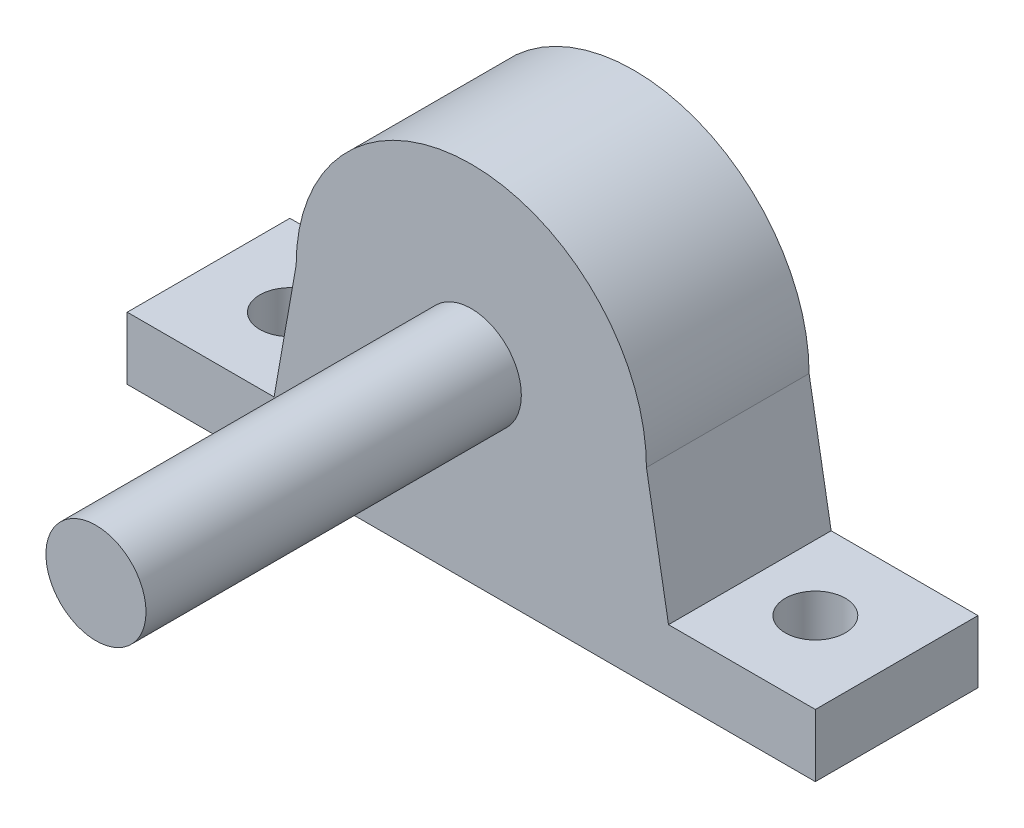
ISO-10303-21;
HEADER;
FILE_DESCRIPTION(('STEP AP214'),'2;1');
FILE_NAME('part.step','',(''),(''),'','','');
FILE_SCHEMA(('AUTOMOTIVE_DESIGN { 1 0 10303 214 1 1 1 1 }'));
ENDSEC;
DATA;
#1=APPLICATION_CONTEXT('core data for automotive mechanical design processes');
#2=APPLICATION_PROTOCOL_DEFINITION('international standard','automotive_design',2000,#1);
#3=PRODUCT_CONTEXT('',#1,'mechanical');
#4=PRODUCT('Part','Part','',(#3));
#5=PRODUCT_RELATED_PRODUCT_CATEGORY('part','',(#4));
#6=PRODUCT_DEFINITION_FORMATION('','',#4);
#7=PRODUCT_DEFINITION_CONTEXT('part definition',#1,'design');
#8=PRODUCT_DEFINITION('design','',#6,#7);
#9=PRODUCT_DEFINITION_SHAPE('','',#8);
#10=(LENGTH_UNIT() NAMED_UNIT(*) SI_UNIT(.MILLI.,.METRE.));
#11=(NAMED_UNIT(*) PLANE_ANGLE_UNIT() SI_UNIT($,.RADIAN.));
#12=(NAMED_UNIT(*) SI_UNIT($,.STERADIAN.) SOLID_ANGLE_UNIT());
#13=UNCERTAINTY_MEASURE_WITH_UNIT(LENGTH_MEASURE(1.E-05),#10,'distance_accuracy_value','');
#14=(GEOMETRIC_REPRESENTATION_CONTEXT(3) GLOBAL_UNCERTAINTY_ASSIGNED_CONTEXT((#13)) GLOBAL_UNIT_ASSIGNED_CONTEXT((#10,
#11,#12)) REPRESENTATION_CONTEXT('',''));
#15=CARTESIAN_POINT('',(0.,0.,0.));
#16=DIRECTION('',(0.,0.,1.));
#17=DIRECTION('',(1.,0.,0.));
#18=AXIS2_PLACEMENT_3D('',#15,#16,#17);
#19=CARTESIAN_POINT('',(0.,0.,13.));
#20=DIRECTION('',(1.,0.,0.));
#21=DIRECTION('',(0.,0.,-1.));
#22=AXIS2_PLACEMENT_3D('',#19,#20,#21);
#23=PLANE('',#22);
#24=DIRECTION('',(0.,-1.,0.));
#25=VECTOR('',#24,1.);
#26=CARTESIAN_POINT('',(0.,0.,0.));
#27=LINE('',#26,#25);
#28=CARTESIAN_POINT('',(0.,5.,0.));
#29=VERTEX_POINT('',#28);
#30=CARTESIAN_POINT('',(0.,0.,0.));
#31=VERTEX_POINT('',#30);
#32=EDGE_CURVE('E135',#29,#31,#27,.T.);
#33=ORIENTED_EDGE('',*,*,#32,.T.);
#34=DIRECTION('',(0.,0.,-1.));
#35=VECTOR('',#34,1.);
#36=CARTESIAN_POINT('',(0.,0.,13.));
#37=LINE('',#36,#35);
#38=CARTESIAN_POINT('',(0.,0.,13.));
#39=VERTEX_POINT('',#38);
#40=EDGE_CURVE('E11',#39,#31,#37,.T.);
#41=ORIENTED_EDGE('',*,*,#40,.F.);
#42=DIRECTION('',(0.,-1.,0.));
#43=VECTOR('',#42,1.);
#44=CARTESIAN_POINT('',(0.,0.,13.));
#45=LINE('',#44,#43);
#46=CARTESIAN_POINT('',(0.,5.,13.));
#47=VERTEX_POINT('',#46);
#48=EDGE_CURVE('E150',#47,#39,#45,.T.);
#49=ORIENTED_EDGE('',*,*,#48,.F.);
#50=DIRECTION('',(0.,0.,-1.));
#51=VECTOR('',#50,1.);
#52=CARTESIAN_POINT('',(0.,5.,13.));
#53=LINE('',#52,#51);
#54=EDGE_CURVE('E131',#47,#29,#53,.T.);
#55=ORIENTED_EDGE('',*,*,#54,.T.);
#56=EDGE_LOOP('',(#33,#41,#49,#55));
#57=FACE_BOUND('',#56,.T.);
#58=ADVANCED_FACE('F39',(#57),#23,.F.);
#59=CARTESIAN_POINT('',(0.,0.,13.));
#60=DIRECTION('',(0.,1.,0.));
#61=DIRECTION('',(0.,0.,1.));
#62=AXIS2_PLACEMENT_3D('',#59,#60,#61);
#63=PLANE('',#62);
#64=CARTESIAN_POINT('',(6.5,0.,6.5));
#65=DIRECTION('',(0.,1.,0.));
#66=DIRECTION('',(0.,0.,1.));
#67=AXIS2_PLACEMENT_3D('',#64,#65,#66);
#68=CIRCLE('',#67,2.4);
#69=CARTESIAN_POINT('',(6.5,0.,8.9));
#70=VERTEX_POINT('',#69);
#71=EDGE_CURVE('E185',#70,#70,#68,.F.);
#72=ORIENTED_EDGE('',*,*,#71,.F.);
#73=EDGE_LOOP('',(#72));
#74=FACE_BOUND('',#73,.T.);
#75=CARTESIAN_POINT('',(48.5,0.,6.5));
#76=DIRECTION('',(0.,1.,0.));
#77=DIRECTION('',(0.,0.,1.));
#78=AXIS2_PLACEMENT_3D('',#75,#76,#77);
#79=CIRCLE('',#78,2.4);
#80=CARTESIAN_POINT('',(48.5,0.,8.9));
#81=VERTEX_POINT('',#80);
#82=EDGE_CURVE('E190',#81,#81,#79,.F.);
#83=ORIENTED_EDGE('',*,*,#82,.F.);
#84=EDGE_LOOP('',(#83));
#85=FACE_BOUND('',#84,.T.);
#86=DIRECTION('',(1.,0.,0.));
#87=VECTOR('',#86,1.);
#88=CARTESIAN_POINT('',(0.,0.,0.));
#89=LINE('',#88,#87);
#90=CARTESIAN_POINT('',(55.,0.,0.));
#91=VERTEX_POINT('',#90);
#92=EDGE_CURVE('E138',#31,#91,#89,.T.);
#93=ORIENTED_EDGE('',*,*,#92,.T.);
#94=DIRECTION('',(0.,0.,-1.));
#95=VECTOR('',#94,1.);
#96=CARTESIAN_POINT('',(55.,0.,13.));
#97=LINE('',#96,#95);
#98=CARTESIAN_POINT('',(55.,0.,13.));
#99=VERTEX_POINT('',#98);
#100=EDGE_CURVE('E47',#99,#91,#97,.T.);
#101=ORIENTED_EDGE('',*,*,#100,.F.);
#102=DIRECTION('',(1.,0.,0.));
#103=VECTOR('',#102,1.);
#104=CARTESIAN_POINT('',(0.,0.,13.));
#105=LINE('',#104,#103);
#106=EDGE_CURVE('E98',#39,#99,#105,.T.);
#107=ORIENTED_EDGE('',*,*,#106,.F.);
#108=ORIENTED_EDGE('',*,*,#40,.T.);
#109=EDGE_LOOP('',(#93,#101,#107,#108));
#110=FACE_BOUND('',#109,.T.);
#111=ADVANCED_FACE('F218',(#74,#85,#110),#63,.F.);
#112=CARTESIAN_POINT('',(55.,5.,13.));
#113=DIRECTION('',(-1.,0.,0.));
#114=DIRECTION('',(0.,0.,1.));
#115=AXIS2_PLACEMENT_3D('',#112,#113,#114);
#116=PLANE('',#115);
#117=DIRECTION('',(0.,1.,0.));
#118=VECTOR('',#117,1.);
#119=CARTESIAN_POINT('',(55.,5.,0.));
#120=LINE('',#119,#118);
#121=CARTESIAN_POINT('',(55.,5.,0.));
#122=VERTEX_POINT('',#121);
#123=EDGE_CURVE('E141',#91,#122,#120,.T.);
#124=ORIENTED_EDGE('',*,*,#123,.T.);
#125=DIRECTION('',(0.,0.,-1.));
#126=VECTOR('',#125,1.);
#127=CARTESIAN_POINT('',(55.,5.,13.));
#128=LINE('',#127,#126);
#129=CARTESIAN_POINT('',(55.,5.,13.));
#130=VERTEX_POINT('',#129);
#131=EDGE_CURVE('E157',#130,#122,#128,.T.);
#132=ORIENTED_EDGE('',*,*,#131,.F.);
#133=DIRECTION('',(0.,1.,0.));
#134=VECTOR('',#133,1.);
#135=CARTESIAN_POINT('',(55.,5.,13.));
#136=LINE('',#135,#134);
#137=EDGE_CURVE('E165',#99,#130,#136,.T.);
#138=ORIENTED_EDGE('',*,*,#137,.F.);
#139=ORIENTED_EDGE('',*,*,#100,.T.);
#140=EDGE_LOOP('',(#124,#132,#138,#139));
#141=FACE_BOUND('',#140,.T.);
#142=ADVANCED_FACE('F163',(#141),#116,.F.);
#143=CARTESIAN_POINT('',(43.2632698070846,5.,13.));
#144=DIRECTION('',(0.,-1.,0.));
#145=DIRECTION('',(1.,0.,0.));
#146=AXIS2_PLACEMENT_3D('',#143,#144,#145);
#147=PLANE('',#146);
#148=CARTESIAN_POINT('',(48.5,5.,6.5));
#149=DIRECTION('',(0.,1.,0.));
#150=DIRECTION('',(-1.,0.,0.));
#151=AXIS2_PLACEMENT_3D('',#148,#149,#150);
#152=CIRCLE('',#151,2.4);
#153=CARTESIAN_POINT('',(46.1,5.,6.5));
#154=VERTEX_POINT('',#153);
#155=EDGE_CURVE('E186',#154,#154,#152,.T.);
#156=ORIENTED_EDGE('',*,*,#155,.F.);
#157=EDGE_LOOP('',(#156));
#158=FACE_BOUND('',#157,.T.);
#159=DIRECTION('',(-1.,0.,0.));
#160=VECTOR('',#159,1.);
#161=CARTESIAN_POINT('',(43.2632698070846,5.,0.));
#162=LINE('',#161,#160);
#163=CARTESIAN_POINT('',(43.2632698070846,5.,0.));
#164=VERTEX_POINT('',#163);
#165=EDGE_CURVE('E143',#122,#164,#162,.T.);
#166=ORIENTED_EDGE('',*,*,#165,.T.);
#167=DIRECTION('',(0.,0.,-1.));
#168=VECTOR('',#167,1.);
#169=CARTESIAN_POINT('',(43.2632698070846,5.,13.));
#170=LINE('',#169,#168);
#171=CARTESIAN_POINT('',(43.2632698070846,5.,13.));
#172=VERTEX_POINT('',#171);
#173=EDGE_CURVE('E154',#172,#164,#170,.T.);
#174=ORIENTED_EDGE('',*,*,#173,.F.);
#175=DIRECTION('',(-1.,0.,0.));
#176=VECTOR('',#175,1.);
#177=CARTESIAN_POINT('',(43.2632698070846,5.,13.));
#178=LINE('',#177,#176);
#179=EDGE_CURVE('E177',#130,#172,#178,.T.);
#180=ORIENTED_EDGE('',*,*,#179,.F.);
#181=ORIENTED_EDGE('',*,*,#131,.T.);
#182=EDGE_LOOP('',(#166,#174,#180,#181));
#183=FACE_BOUND('',#182,.T.);
#184=ADVANCED_FACE('F173',(#158,#183),#147,.F.);
#185=CARTESIAN_POINT('',(41.5,15.,13.));
#186=DIRECTION('',(-0.984807753012209,-0.173648177666923,0.));
#187=DIRECTION('',(0.173648177666923,-0.984807753012209,0.));
#188=AXIS2_PLACEMENT_3D('',#185,#186,#187);
#189=PLANE('',#188);
#190=DIRECTION('',(-0.173648177666923,0.984807753012209,0.));
#191=VECTOR('',#190,1.);
#192=CARTESIAN_POINT('',(41.5,15.,0.));
#193=LINE('',#192,#191);
#194=CARTESIAN_POINT('',(41.5,15.,0.));
#195=VERTEX_POINT('',#194);
#196=EDGE_CURVE('E145',#164,#195,#193,.T.);
#197=ORIENTED_EDGE('',*,*,#196,.T.);
#198=DIRECTION('',(0.,0.,-1.));
#199=VECTOR('',#198,1.);
#200=CARTESIAN_POINT('',(41.5,15.,13.));
#201=LINE('',#200,#199);
#202=CARTESIAN_POINT('',(41.5,15.,13.));
#203=VERTEX_POINT('',#202);
#204=EDGE_CURVE('E126',#203,#195,#201,.T.);
#205=ORIENTED_EDGE('',*,*,#204,.F.);
#206=DIRECTION('',(-0.173648177666923,0.984807753012209,0.));
#207=VECTOR('',#206,1.);
#208=CARTESIAN_POINT('',(41.5,15.,13.));
#209=LINE('',#208,#207);
#210=EDGE_CURVE('E117',#172,#203,#209,.T.);
#211=ORIENTED_EDGE('',*,*,#210,.F.);
#212=ORIENTED_EDGE('',*,*,#173,.T.);
#213=EDGE_LOOP('',(#197,#205,#211,#212));
#214=FACE_BOUND('',#213,.T.);
#215=ADVANCED_FACE('F176',(#214),#189,.F.);
#216=CARTESIAN_POINT('',(27.5,15.,13.));
#217=DIRECTION('',(0.,0.,-1.));
#218=DIRECTION('',(-1.,0.,0.));
#219=AXIS2_PLACEMENT_3D('',#216,#217,#218);
#220=CYLINDRICAL_SURFACE('',#219,14.);
#221=CARTESIAN_POINT('',(27.5,15.,0.));
#222=DIRECTION('',(0.,0.,1.));
#223=DIRECTION('',(1.,0.,0.));
#224=AXIS2_PLACEMENT_3D('',#221,#222,#223);
#225=CIRCLE('',#224,14.);
#226=CARTESIAN_POINT('',(13.5,15.,0.));
#227=VERTEX_POINT('',#226);
#228=EDGE_CURVE('E125',#195,#227,#225,.T.);
#229=ORIENTED_EDGE('',*,*,#228,.T.);
#230=DIRECTION('',(0.,0.,-1.));
#231=VECTOR('',#230,1.);
#232=CARTESIAN_POINT('',(13.5,15.,13.));
#233=LINE('',#232,#231);
#234=CARTESIAN_POINT('',(13.5,15.,13.));
#235=VERTEX_POINT('',#234);
#236=EDGE_CURVE('E122',#235,#227,#233,.T.);
#237=ORIENTED_EDGE('',*,*,#236,.F.);
#238=CARTESIAN_POINT('',(27.5,15.,13.));
#239=DIRECTION('',(0.,0.,1.));
#240=DIRECTION('',(1.,0.,0.));
#241=AXIS2_PLACEMENT_3D('',#238,#239,#240);
#242=CIRCLE('',#241,14.);
#243=EDGE_CURVE('E111',#203,#235,#242,.T.);
#244=ORIENTED_EDGE('',*,*,#243,.F.);
#245=ORIENTED_EDGE('',*,*,#204,.T.);
#246=EDGE_LOOP('',(#229,#237,#244,#245));
#247=FACE_BOUND('',#246,.T.);
#248=ADVANCED_FACE('F123',(#247),#220,.T.);
#249=CARTESIAN_POINT('',(13.5,15.,13.));
#250=DIRECTION('',(0.984807753012209,-0.173648177666924,0.));
#251=DIRECTION('',(0.173648177666924,0.984807753012209,0.));
#252=AXIS2_PLACEMENT_3D('',#249,#250,#251);
#253=PLANE('',#252);
#254=DIRECTION('',(-0.173648177666924,-0.984807753012209,0.));
#255=VECTOR('',#254,1.);
#256=CARTESIAN_POINT('',(13.5,15.,0.));
#257=LINE('',#256,#255);
#258=CARTESIAN_POINT('',(11.7367301929154,5.,0.));
#259=VERTEX_POINT('',#258);
#260=EDGE_CURVE('E84',#227,#259,#257,.T.);
#261=ORIENTED_EDGE('',*,*,#260,.T.);
#262=DIRECTION('',(0.,0.,-1.));
#263=VECTOR('',#262,1.);
#264=CARTESIAN_POINT('',(11.7367301929154,5.,13.));
#265=LINE('',#264,#263);
#266=CARTESIAN_POINT('',(11.7367301929154,5.,13.));
#267=VERTEX_POINT('',#266);
#268=EDGE_CURVE('E127',#267,#259,#265,.T.);
#269=ORIENTED_EDGE('',*,*,#268,.F.);
#270=DIRECTION('',(-0.173648177666924,-0.984807753012209,0.));
#271=VECTOR('',#270,1.);
#272=CARTESIAN_POINT('',(13.5,15.,13.));
#273=LINE('',#272,#271);
#274=EDGE_CURVE('E115',#235,#267,#273,.T.);
#275=ORIENTED_EDGE('',*,*,#274,.F.);
#276=ORIENTED_EDGE('',*,*,#236,.T.);
#277=EDGE_LOOP('',(#261,#269,#275,#276));
#278=FACE_BOUND('',#277,.T.);
#279=ADVANCED_FACE('F129',(#278),#253,.F.);
#280=CARTESIAN_POINT('',(0.,5.,13.));
#281=DIRECTION('',(0.,-1.,0.));
#282=DIRECTION('',(1.,0.,0.));
#283=AXIS2_PLACEMENT_3D('',#280,#281,#282);
#284=PLANE('',#283);
#285=CARTESIAN_POINT('',(6.5,5.,6.5));
#286=DIRECTION('',(0.,1.,0.));
#287=DIRECTION('',(-1.,0.,0.));
#288=AXIS2_PLACEMENT_3D('',#285,#286,#287);
#289=CIRCLE('',#288,2.4);
#290=CARTESIAN_POINT('',(4.1,5.,6.5));
#291=VERTEX_POINT('',#290);
#292=EDGE_CURVE('E189',#291,#291,#289,.T.);
#293=ORIENTED_EDGE('',*,*,#292,.F.);
#294=EDGE_LOOP('',(#293));
#295=FACE_BOUND('',#294,.T.);
#296=DIRECTION('',(-1.,0.,0.));
#297=VECTOR('',#296,1.);
#298=CARTESIAN_POINT('',(0.,5.,0.));
#299=LINE('',#298,#297);
#300=EDGE_CURVE('E90',#259,#29,#299,.T.);
#301=ORIENTED_EDGE('',*,*,#300,.T.);
#302=ORIENTED_EDGE('',*,*,#54,.F.);
#303=DIRECTION('',(-1.,0.,0.));
#304=VECTOR('',#303,1.);
#305=CARTESIAN_POINT('',(0.,5.,13.));
#306=LINE('',#305,#304);
#307=EDGE_CURVE('E55',#267,#47,#306,.T.);
#308=ORIENTED_EDGE('',*,*,#307,.F.);
#309=ORIENTED_EDGE('',*,*,#268,.T.);
#310=EDGE_LOOP('',(#301,#302,#308,#309));
#311=FACE_BOUND('',#310,.T.);
#312=ADVANCED_FACE('F226',(#295,#311),#284,.F.);
#313=CARTESIAN_POINT('',(27.5,15.,13.));
#314=DIRECTION('',(0.,0.,1.));
#315=DIRECTION('',(1.,0.,0.));
#316=AXIS2_PLACEMENT_3D('',#313,#314,#315);
#317=PLANE('',#316);
#318=CARTESIAN_POINT('',(27.5,15.,13.));
#319=DIRECTION('',(0.,0.,1.));
#320=DIRECTION('',(1.,0.,0.));
#321=AXIS2_PLACEMENT_3D('',#318,#319,#320);
#322=CIRCLE('',#321,4.00000000000001);
#323=CARTESIAN_POINT('',(31.5,15.,13.));
#324=VERTEX_POINT('',#323);
#325=EDGE_CURVE('E139',#324,#324,#322,.T.);
#326=ORIENTED_EDGE('',*,*,#325,.F.);
#327=EDGE_LOOP('',(#326));
#328=FACE_BOUND('',#327,.T.);
#329=ORIENTED_EDGE('',*,*,#48,.T.);
#330=ORIENTED_EDGE('',*,*,#106,.T.);
#331=ORIENTED_EDGE('',*,*,#137,.T.);
#332=ORIENTED_EDGE('',*,*,#179,.T.);
#333=ORIENTED_EDGE('',*,*,#210,.T.);
#334=ORIENTED_EDGE('',*,*,#243,.T.);
#335=ORIENTED_EDGE('',*,*,#274,.T.);
#336=ORIENTED_EDGE('',*,*,#307,.T.);
#337=EDGE_LOOP('',(#329,#330,#331,#332,#333,#334,#335,#336));
#338=FACE_BOUND('',#337,.T.);
#339=ADVANCED_FACE('F113',(#328,#338),#317,.T.);
#340=CARTESIAN_POINT('',(27.5,15.,0.));
#341=DIRECTION('',(0.,0.,1.));
#342=DIRECTION('',(1.,0.,0.));
#343=AXIS2_PLACEMENT_3D('',#340,#341,#342);
#344=PLANE('',#343);
#345=ORIENTED_EDGE('',*,*,#32,.F.);
#346=ORIENTED_EDGE('',*,*,#300,.F.);
#347=ORIENTED_EDGE('',*,*,#260,.F.);
#348=ORIENTED_EDGE('',*,*,#228,.F.);
#349=ORIENTED_EDGE('',*,*,#196,.F.);
#350=ORIENTED_EDGE('',*,*,#165,.F.);
#351=ORIENTED_EDGE('',*,*,#123,.F.);
#352=ORIENTED_EDGE('',*,*,#92,.F.);
#353=EDGE_LOOP('',(#345,#346,#347,#348,#349,#350,#351,#352));
#354=FACE_BOUND('',#353,.T.);
#355=ADVANCED_FACE('F169',(#354),#344,.F.);
#356=CARTESIAN_POINT('',(6.5,-0.00100000000000013,6.5));
#357=DIRECTION('',(0.,1.,0.));
#358=DIRECTION('',(-1.,0.,0.));
#359=AXIS2_PLACEMENT_3D('',#356,#357,#358);
#360=CYLINDRICAL_SURFACE('',#359,2.4);
#361=ORIENTED_EDGE('',*,*,#292,.T.);
#362=EDGE_LOOP('',(#361));
#363=FACE_BOUND('',#362,.T.);
#364=ORIENTED_EDGE('',*,*,#71,.T.);
#365=EDGE_LOOP('',(#364));
#366=FACE_BOUND('',#365,.T.);
#367=ADVANCED_FACE('F213',(#363,#366),#360,.F.);
#368=CARTESIAN_POINT('',(48.5,-0.00100000000000273,6.5));
#369=DIRECTION('',(0.,1.,0.));
#370=DIRECTION('',(-1.,0.,0.));
#371=AXIS2_PLACEMENT_3D('',#368,#369,#370);
#372=CYLINDRICAL_SURFACE('',#371,2.4);
#373=ORIENTED_EDGE('',*,*,#155,.T.);
#374=EDGE_LOOP('',(#373));
#375=FACE_BOUND('',#374,.T.);
#376=ORIENTED_EDGE('',*,*,#82,.T.);
#377=EDGE_LOOP('',(#376));
#378=FACE_BOUND('',#377,.T.);
#379=ADVANCED_FACE('F205',(#375,#378),#372,.F.);
#380=CARTESIAN_POINT('',(27.5,15.,0.));
#381=DIRECTION('',(0.,0.,1.));
#382=DIRECTION('',(1.,0.,0.));
#383=AXIS2_PLACEMENT_3D('',#380,#381,#382);
#384=CYLINDRICAL_SURFACE('',#383,4.00000000000001);
#385=CARTESIAN_POINT('',(27.5,15.,43.));
#386=DIRECTION('',(0.,0.,1.));
#387=DIRECTION('',(1.,0.,0.));
#388=AXIS2_PLACEMENT_3D('',#385,#386,#387);
#389=CIRCLE('',#388,4.00000000000001);
#390=CARTESIAN_POINT('',(31.5,15.,43.));
#391=VERTEX_POINT('',#390);
#392=EDGE_CURVE('E193',#391,#391,#389,.T.);
#393=CARTESIAN_POINT('',(31.5,15.,13.));
#394=CARTESIAN_POINT('',(31.5,15.,13.3125));
#395=CARTESIAN_POINT('',(31.5,15.,13.625));
#396=CARTESIAN_POINT('',(31.5,15.,14.25));
#397=CARTESIAN_POINT('',(31.5,15.,14.5625));
#398=CARTESIAN_POINT('',(31.5,15.,15.1875));
#399=CARTESIAN_POINT('',(31.5,15.,15.5));
#400=CARTESIAN_POINT('',(31.5,15.,16.125));
#401=CARTESIAN_POINT('',(31.5,15.,16.4375));
#402=CARTESIAN_POINT('',(31.5,15.,17.0625));
#403=CARTESIAN_POINT('',(31.5,15.,17.375));
#404=CARTESIAN_POINT('',(31.5,15.,18.));
#405=CARTESIAN_POINT('',(31.5,15.,18.3125));
#406=CARTESIAN_POINT('',(31.5,15.,18.9375));
#407=CARTESIAN_POINT('',(31.5,15.,19.25));
#408=CARTESIAN_POINT('',(31.5,15.,19.875));
#409=CARTESIAN_POINT('',(31.5,15.,20.1875));
#410=CARTESIAN_POINT('',(31.5,15.,20.8125));
#411=CARTESIAN_POINT('',(31.5,15.,21.125));
#412=CARTESIAN_POINT('',(31.5,15.,21.75));
#413=CARTESIAN_POINT('',(31.5,15.,22.0625));
#414=CARTESIAN_POINT('',(31.5,15.,22.6875));
#415=CARTESIAN_POINT('',(31.5,15.,23.));
#416=CARTESIAN_POINT('',(31.5,15.,23.625));
#417=CARTESIAN_POINT('',(31.5,15.,23.9375));
#418=CARTESIAN_POINT('',(31.5,15.,24.5625));
#419=CARTESIAN_POINT('',(31.5,15.,24.875));
#420=CARTESIAN_POINT('',(31.5,15.,25.5));
#421=CARTESIAN_POINT('',(31.5,15.,25.8125));
#422=CARTESIAN_POINT('',(31.5,15.,26.4375));
#423=CARTESIAN_POINT('',(31.5,15.,26.75));
#424=CARTESIAN_POINT('',(31.5,15.,27.375));
#425=CARTESIAN_POINT('',(31.5,15.,27.6875));
#426=CARTESIAN_POINT('',(31.5,15.,28.3125));
#427=CARTESIAN_POINT('',(31.5,15.,28.625));
#428=CARTESIAN_POINT('',(31.5,15.,29.25));
#429=CARTESIAN_POINT('',(31.5,15.,29.5625));
#430=CARTESIAN_POINT('',(31.5,15.,30.1875));
#431=CARTESIAN_POINT('',(31.5,15.,30.5));
#432=CARTESIAN_POINT('',(31.5,15.,31.125));
#433=CARTESIAN_POINT('',(31.5,15.,31.4375));
#434=CARTESIAN_POINT('',(31.5,15.,32.0625));
#435=CARTESIAN_POINT('',(31.5,15.,32.375));
#436=CARTESIAN_POINT('',(31.5,15.,33.));
#437=CARTESIAN_POINT('',(31.5,15.,33.3125));
#438=CARTESIAN_POINT('',(31.5,15.,33.9375));
#439=CARTESIAN_POINT('',(31.5,15.,34.25));
#440=CARTESIAN_POINT('',(31.5,15.,34.875));
#441=CARTESIAN_POINT('',(31.5,15.,35.1875));
#442=CARTESIAN_POINT('',(31.5,15.,35.8125));
#443=CARTESIAN_POINT('',(31.5,15.,36.125));
#444=CARTESIAN_POINT('',(31.5,15.,36.75));
#445=CARTESIAN_POINT('',(31.5,15.,37.0625));
#446=CARTESIAN_POINT('',(31.5,15.,37.6875));
#447=CARTESIAN_POINT('',(31.5,15.,38.));
#448=CARTESIAN_POINT('',(31.5,15.,38.625));
#449=CARTESIAN_POINT('',(31.5,15.,38.9375));
#450=CARTESIAN_POINT('',(31.5,15.,39.5625));
#451=CARTESIAN_POINT('',(31.5,15.,39.875));
#452=CARTESIAN_POINT('',(31.5,15.,40.5));
#453=CARTESIAN_POINT('',(31.5,15.,40.8125));
#454=CARTESIAN_POINT('',(31.5,15.,41.4375));
#455=CARTESIAN_POINT('',(31.5,15.,41.75));
#456=CARTESIAN_POINT('',(31.5,15.,42.375));
#457=CARTESIAN_POINT('',(31.5,15.,42.6875));
#458=CARTESIAN_POINT('',(31.5,15.,43.));
#459=B_SPLINE_CURVE_WITH_KNOTS('',3,(#393,#394,#395,#396,#397,#398,#399,#400,#401,#402,#403,
#404,#405,#406,#407,#408,#409,#410,#411,#412,#413,#414,#415,#416,#417,#418,#419,#420,#421,#422,
#423,#424,#425,#426,#427,#428,#429,#430,#431,#432,#433,#434,#435,#436,#437,#438,#439,#440,#441,
#442,#443,#444,#445,#446,#447,#448,#449,#450,#451,#452,#453,#454,#455,#456,#457,#458),
.UNSPECIFIED.,.F.,.F.,(4,2,2,2,2,2,2,2,2,2,2,2,2,2,2,2,2,2,2,2,2,2,2,2,2,2,2,2,2,2,2,2,4),(0.,
0.937499999999999,1.875,2.8125,3.75,4.6875,5.625,6.5625,7.5,8.43749999999999,9.375,10.3125,
11.25,12.1875,13.125,14.0625,15.,15.9375,16.875,17.8125,18.75,19.6875,20.625,21.5625,22.5,
23.4375,24.375,25.3125,26.25,27.1875,28.125,29.0625,30.),.UNSPECIFIED.);
#460=EDGE_CURVE('BSEAM203',#324,#391,#459,.T.);
#461=ORIENTED_EDGE('',*,*,#325,.T.);
#462=ORIENTED_EDGE('',*,*,#392,.F.);
#463=ORIENTED_EDGE('',*,*,#460,.T.);
#464=ORIENTED_EDGE('',*,*,#460,.F.);
#465=EDGE_LOOP('',(#461,#463,#462,#464));
#466=FACE_BOUND('',#465,.T.);
#467=ADVANCED_FACE('F203',(#466),#384,.T.);
#468=CARTESIAN_POINT('',(27.5,15.,43.));
#469=DIRECTION('',(0.,0.,1.));
#470=DIRECTION('',(1.,0.,0.));
#471=AXIS2_PLACEMENT_3D('',#468,#469,#470);
#472=PLANE('',#471);
#473=ORIENTED_EDGE('',*,*,#392,.T.);
#474=EDGE_LOOP('',(#473));
#475=FACE_BOUND('',#474,.T.);
#476=ADVANCED_FACE('F201',(#475),#472,.T.);
#477=CLOSED_SHELL('',(#58,#111,#142,#184,#215,#248,#279,#312,#339,#355,#367,#379,#467,#476));
#478=MANIFOLD_SOLID_BREP('B2',#477);
#479=ADVANCED_BREP_SHAPE_REPRESENTATION('',(#18,#478),#14);
#480=SHAPE_DEFINITION_REPRESENTATION(#9,#479);
ENDSEC;
END-ISO-10303-21;
